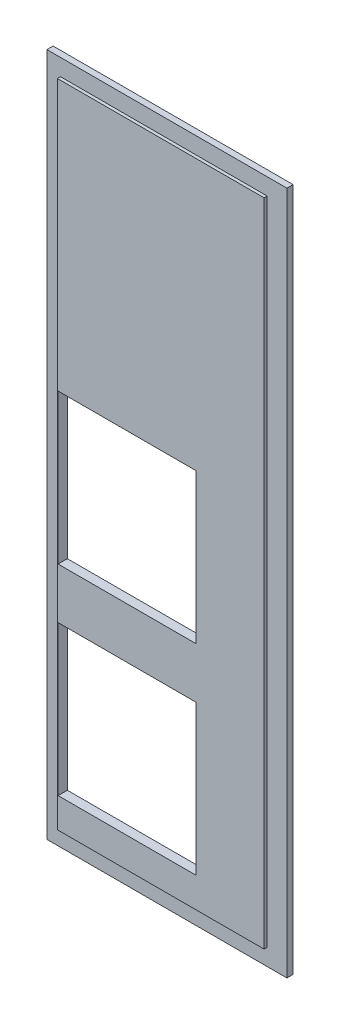
ISO-10303-21;
HEADER;
FILE_DESCRIPTION(('STEP AP214'),'2;1');
FILE_NAME('part.step','',(''),(''),'','','');
FILE_SCHEMA(('AUTOMOTIVE_DESIGN { 1 0 10303 214 1 1 1 1 }'));
ENDSEC;
DATA;
#1=APPLICATION_CONTEXT('core data for automotive mechanical design processes');
#2=APPLICATION_PROTOCOL_DEFINITION('international standard','automotive_design',2000,#1);
#3=PRODUCT_CONTEXT('',#1,'mechanical');
#4=PRODUCT('Part','Part','',(#3));
#5=PRODUCT_RELATED_PRODUCT_CATEGORY('part','',(#4));
#6=PRODUCT_DEFINITION_FORMATION('','',#4);
#7=PRODUCT_DEFINITION_CONTEXT('part definition',#1,'design');
#8=PRODUCT_DEFINITION('design','',#6,#7);
#9=PRODUCT_DEFINITION_SHAPE('','',#8);
#10=(LENGTH_UNIT() NAMED_UNIT(*) SI_UNIT(.MILLI.,.METRE.));
#11=(NAMED_UNIT(*) PLANE_ANGLE_UNIT() SI_UNIT($,.RADIAN.));
#12=(NAMED_UNIT(*) SI_UNIT($,.STERADIAN.) SOLID_ANGLE_UNIT());
#13=UNCERTAINTY_MEASURE_WITH_UNIT(LENGTH_MEASURE(1.E-05),#10,'distance_accuracy_value','');
#14=(GEOMETRIC_REPRESENTATION_CONTEXT(3) GLOBAL_UNCERTAINTY_ASSIGNED_CONTEXT((#13)) GLOBAL_UNIT_ASSIGNED_CONTEXT((#10,
#11,#12)) REPRESENTATION_CONTEXT('',''));
#15=CARTESIAN_POINT('',(0.,0.,0.));
#16=DIRECTION('',(0.,0.,1.));
#17=DIRECTION('',(1.,0.,0.));
#18=AXIS2_PLACEMENT_3D('',#15,#16,#17);
#19=CARTESIAN_POINT('',(3.90000000000003,-9.84999999999989,-1.));
#20=DIRECTION('',(0.,-1.,0.));
#21=DIRECTION('',(1.,0.,0.));
#22=AXIS2_PLACEMENT_3D('',#19,#20,#21);
#23=PLANE('',#22);
#24=DIRECTION('',(1.,0.,0.));
#25=VECTOR('',#24,1.);
#26=CARTESIAN_POINT('',(3.90000000000003,-9.84999999999989,0.));
#27=LINE('',#26,#25);
#28=CARTESIAN_POINT('',(3.90000000000003,-9.84999999999989,0.));
#29=VERTEX_POINT('',#28);
#30=CARTESIAN_POINT('',(42.75,-9.84999999999989,0.));
#31=VERTEX_POINT('',#30);
#32=EDGE_CURVE('E248',#29,#31,#27,.T.);
#33=ORIENTED_EDGE('',*,*,#32,.F.);
#34=DIRECTION('',(0.,0.,1.));
#35=VECTOR('',#34,1.);
#36=CARTESIAN_POINT('',(3.90000000000003,-9.84999999999989,-1.));
#37=LINE('',#36,#35);
#38=CARTESIAN_POINT('',(3.90000000000003,-9.84999999999989,-1.));
#39=VERTEX_POINT('',#38);
#40=EDGE_CURVE('E11',#39,#29,#37,.T.);
#41=ORIENTED_EDGE('',*,*,#40,.F.);
#42=DIRECTION('',(1.,0.,0.));
#43=VECTOR('',#42,1.);
#44=CARTESIAN_POINT('',(3.90000000000003,-9.84999999999989,-1.));
#45=LINE('',#44,#43);
#46=CARTESIAN_POINT('',(42.75,-9.84999999999989,-1.));
#47=VERTEX_POINT('',#46);
#48=EDGE_CURVE('E249',#39,#47,#45,.T.);
#49=ORIENTED_EDGE('',*,*,#48,.T.);
#50=DIRECTION('',(0.,0.,1.));
#51=VECTOR('',#50,1.);
#52=CARTESIAN_POINT('',(42.75,-9.84999999999989,-1.));
#53=LINE('',#52,#51);
#54=EDGE_CURVE('E35',#47,#31,#53,.T.);
#55=ORIENTED_EDGE('',*,*,#54,.T.);
#56=EDGE_LOOP('',(#33,#41,#49,#55));
#57=FACE_BOUND('',#56,.T.);
#58=ADVANCED_FACE('F32',(#57),#23,.T.);
#59=CARTESIAN_POINT('',(3.90000000000002,100.85,-1.));
#60=DIRECTION('',(-1.,0.,0.));
#61=DIRECTION('',(0.,-1.,0.));
#62=AXIS2_PLACEMENT_3D('',#59,#60,#61);
#63=PLANE('',#62);
#64=DIRECTION('',(0.,-1.,0.));
#65=VECTOR('',#64,1.);
#66=CARTESIAN_POINT('',(3.90000000000002,100.85,0.));
#67=LINE('',#66,#65);
#68=CARTESIAN_POINT('',(3.90000000000002,100.85,0.));
#69=VERTEX_POINT('',#68);
#70=EDGE_CURVE('E253',#69,#29,#67,.T.);
#71=ORIENTED_EDGE('',*,*,#70,.F.);
#72=DIRECTION('',(0.,0.,1.));
#73=VECTOR('',#72,1.);
#74=CARTESIAN_POINT('',(3.90000000000002,100.85,-1.));
#75=LINE('',#74,#73);
#76=CARTESIAN_POINT('',(3.90000000000002,100.85,-1.));
#77=VERTEX_POINT('',#76);
#78=EDGE_CURVE('E40',#77,#69,#75,.T.);
#79=ORIENTED_EDGE('',*,*,#78,.F.);
#80=DIRECTION('',(0.,-1.,0.));
#81=VECTOR('',#80,1.);
#82=CARTESIAN_POINT('',(3.90000000000002,100.85,-1.));
#83=LINE('',#82,#81);
#84=EDGE_CURVE('E259',#77,#39,#83,.T.);
#85=ORIENTED_EDGE('',*,*,#84,.T.);
#86=ORIENTED_EDGE('',*,*,#40,.T.);
#87=EDGE_LOOP('',(#71,#79,#85,#86));
#88=FACE_BOUND('',#87,.T.);
#89=ADVANCED_FACE('F285',(#88),#63,.T.);
#90=CARTESIAN_POINT('',(42.75,100.85,-1.));
#91=DIRECTION('',(0.,1.,0.));
#92=DIRECTION('',(0.,0.,1.));
#93=AXIS2_PLACEMENT_3D('',#90,#91,#92);
#94=PLANE('',#93);
#95=DIRECTION('',(-1.,0.,0.));
#96=VECTOR('',#95,1.);
#97=CARTESIAN_POINT('',(42.75,100.85,0.));
#98=LINE('',#97,#96);
#99=CARTESIAN_POINT('',(42.75,100.85,0.));
#100=VERTEX_POINT('',#99);
#101=EDGE_CURVE('E267',#100,#69,#98,.T.);
#102=ORIENTED_EDGE('',*,*,#101,.F.);
#103=DIRECTION('',(0.,0.,1.));
#104=VECTOR('',#103,1.);
#105=CARTESIAN_POINT('',(42.75,100.85,-1.));
#106=LINE('',#105,#104);
#107=CARTESIAN_POINT('',(42.75,100.85,-1.));
#108=VERTEX_POINT('',#107);
#109=EDGE_CURVE('E272',#108,#100,#106,.T.);
#110=ORIENTED_EDGE('',*,*,#109,.F.);
#111=DIRECTION('',(-1.,0.,0.));
#112=VECTOR('',#111,1.);
#113=CARTESIAN_POINT('',(42.75,100.85,-1.));
#114=LINE('',#113,#112);
#115=EDGE_CURVE('E256',#108,#77,#114,.T.);
#116=ORIENTED_EDGE('',*,*,#115,.T.);
#117=ORIENTED_EDGE('',*,*,#78,.T.);
#118=EDGE_LOOP('',(#102,#110,#116,#117));
#119=FACE_BOUND('',#118,.T.);
#120=ADVANCED_FACE('F291',(#119),#94,.T.);
#121=CARTESIAN_POINT('',(42.75,-9.84999999999989,-1.));
#122=DIRECTION('',(1.,0.,0.));
#123=DIRECTION('',(0.,1.,0.));
#124=AXIS2_PLACEMENT_3D('',#121,#122,#123);
#125=PLANE('',#124);
#126=DIRECTION('',(0.,1.,0.));
#127=VECTOR('',#126,1.);
#128=CARTESIAN_POINT('',(42.75,-9.84999999999989,0.));
#129=LINE('',#128,#127);
#130=EDGE_CURVE('E264',#31,#100,#129,.T.);
#131=ORIENTED_EDGE('',*,*,#130,.F.);
#132=ORIENTED_EDGE('',*,*,#54,.F.);
#133=DIRECTION('',(0.,1.,0.));
#134=VECTOR('',#133,1.);
#135=CARTESIAN_POINT('',(42.75,-9.84999999999989,-1.));
#136=LINE('',#135,#134);
#137=EDGE_CURVE('E252',#47,#108,#136,.T.);
#138=ORIENTED_EDGE('',*,*,#137,.T.);
#139=ORIENTED_EDGE('',*,*,#109,.T.);
#140=EDGE_LOOP('',(#131,#132,#138,#139));
#141=FACE_BOUND('',#140,.T.);
#142=ADVANCED_FACE('F280',(#141),#125,.T.);
#143=CARTESIAN_POINT('',(0.,0.,-1.));
#144=DIRECTION('',(0.,0.,1.));
#145=DIRECTION('',(1.,0.,0.));
#146=AXIS2_PLACEMENT_3D('',#143,#144,#145);
#147=PLANE('',#146);
#148=DIRECTION('',(-1.,0.,0.));
#149=VECTOR('',#148,1.);
#150=CARTESIAN_POINT('',(0.,54.4000000000001,-1.));
#151=LINE('',#150,#149);
#152=CARTESIAN_POINT('',(28.5555931067609,54.4000000000001,-1.));
#153=VERTEX_POINT('',#152);
#154=CARTESIAN_POINT('',(6.21619222488181,54.4000000000001,-1.));
#155=VERTEX_POINT('',#154);
#156=EDGE_CURVE('E209',#153,#155,#151,.T.);
#157=ORIENTED_EDGE('',*,*,#156,.T.);
#158=DIRECTION('',(0.,-1.,0.));
#159=VECTOR('',#158,1.);
#160=CARTESIAN_POINT('',(6.21619222488182,0.,-1.));
#161=LINE('',#160,#159);
#162=CARTESIAN_POINT('',(6.21619222488181,30.1500000000001,-1.));
#163=VERTEX_POINT('',#162);
#164=EDGE_CURVE('E212',#155,#163,#161,.T.);
#165=ORIENTED_EDGE('',*,*,#164,.T.);
#166=DIRECTION('',(1.,0.,0.));
#167=VECTOR('',#166,1.);
#168=CARTESIAN_POINT('',(0.,30.1500000000001,-1.));
#169=LINE('',#168,#167);
#170=CARTESIAN_POINT('',(28.5555931067609,30.1500000000001,-1.));
#171=VERTEX_POINT('',#170);
#172=EDGE_CURVE('E206',#163,#171,#169,.T.);
#173=ORIENTED_EDGE('',*,*,#172,.T.);
#174=DIRECTION('',(0.,1.,0.));
#175=VECTOR('',#174,1.);
#176=CARTESIAN_POINT('',(28.5555931067609,0.,-1.));
#177=LINE('',#176,#175);
#178=EDGE_CURVE('E150',#171,#153,#177,.T.);
#179=ORIENTED_EDGE('',*,*,#178,.T.);
#180=EDGE_LOOP('',(#157,#165,#173,#179));
#181=FACE_BOUND('',#180,.T.);
#182=DIRECTION('',(-1.,0.,0.));
#183=VECTOR('',#182,1.);
#184=CARTESIAN_POINT('',(0.,21.9444436948561,-1.));
#185=LINE('',#184,#183);
#186=CARTESIAN_POINT('',(28.5555931067609,21.9444436948561,-1.));
#187=VERTEX_POINT('',#186);
#188=CARTESIAN_POINT('',(6.21619222488181,21.9444436948561,-1.));
#189=VERTEX_POINT('',#188);
#190=EDGE_CURVE('E200',#187,#189,#185,.T.);
#191=ORIENTED_EDGE('',*,*,#190,.T.);
#192=DIRECTION('',(0.,-1.,0.));
#193=VECTOR('',#192,1.);
#194=CARTESIAN_POINT('',(6.21619222488182,0.,-1.));
#195=LINE('',#194,#193);
#196=CARTESIAN_POINT('',(6.21619222488182,-2.30555630514393,-1.));
#197=VERTEX_POINT('',#196);
#198=EDGE_CURVE('E203',#189,#197,#195,.T.);
#199=ORIENTED_EDGE('',*,*,#198,.T.);
#200=DIRECTION('',(1.,0.,0.));
#201=VECTOR('',#200,1.);
#202=CARTESIAN_POINT('',(0.,-2.30555630514393,-1.));
#203=LINE('',#202,#201);
#204=CARTESIAN_POINT('',(28.5555931067609,-2.30555630514393,-1.));
#205=VERTEX_POINT('',#204);
#206=EDGE_CURVE('E174',#197,#205,#203,.T.);
#207=ORIENTED_EDGE('',*,*,#206,.T.);
#208=DIRECTION('',(0.,1.,0.));
#209=VECTOR('',#208,1.);
#210=CARTESIAN_POINT('',(28.5555931067609,0.,-1.));
#211=LINE('',#210,#209);
#212=EDGE_CURVE('E197',#205,#187,#211,.T.);
#213=ORIENTED_EDGE('',*,*,#212,.T.);
#214=EDGE_LOOP('',(#191,#199,#207,#213));
#215=FACE_BOUND('',#214,.T.);
#216=ORIENTED_EDGE('',*,*,#48,.F.);
#217=ORIENTED_EDGE('',*,*,#84,.F.);
#218=ORIENTED_EDGE('',*,*,#115,.F.);
#219=ORIENTED_EDGE('',*,*,#137,.F.);
#220=EDGE_LOOP('',(#216,#217,#218,#219));
#221=FACE_BOUND('',#220,.T.);
#222=ADVANCED_FACE('F288',(#181,#215,#221),#147,.F.);
#223=CARTESIAN_POINT('',(0.,0.,0.));
#224=DIRECTION('',(0.,0.,1.));
#225=DIRECTION('',(1.,0.,0.));
#226=AXIS2_PLACEMENT_3D('',#223,#224,#225);
#227=PLANE('',#226);
#228=DIRECTION('',(0.,1.,0.));
#229=VECTOR('',#228,1.);
#230=CARTESIAN_POINT('',(39.55,98.1500000000001,0.));
#231=LINE('',#230,#229);
#232=CARTESIAN_POINT('',(39.55,-7.14999999999988,0.));
#233=VERTEX_POINT('',#232);
#234=CARTESIAN_POINT('',(39.55,98.1500000000001,0.));
#235=VERTEX_POINT('',#234);
#236=EDGE_CURVE('E215',#233,#235,#231,.T.);
#237=ORIENTED_EDGE('',*,*,#236,.F.);
#238=DIRECTION('',(1.,0.,0.));
#239=VECTOR('',#238,1.);
#240=CARTESIAN_POINT('',(39.55,-7.14999999999988,0.));
#241=LINE('',#240,#239);
#242=CARTESIAN_POINT('',(6.10000000000004,-7.14999999999988,0.));
#243=VERTEX_POINT('',#242);
#244=EDGE_CURVE('E220',#243,#233,#241,.T.);
#245=ORIENTED_EDGE('',*,*,#244,.F.);
#246=DIRECTION('',(0.,-1.,0.));
#247=VECTOR('',#246,1.);
#248=CARTESIAN_POINT('',(6.10000000000004,-7.14999999999988,0.));
#249=LINE('',#248,#247);
#250=CARTESIAN_POINT('',(6.10000000000002,98.1500000000001,0.));
#251=VERTEX_POINT('',#250);
#252=EDGE_CURVE('E232',#251,#243,#249,.T.);
#253=ORIENTED_EDGE('',*,*,#252,.F.);
#254=DIRECTION('',(-1.,0.,0.));
#255=VECTOR('',#254,1.);
#256=CARTESIAN_POINT('',(6.10000000000002,98.1500000000001,0.));
#257=LINE('',#256,#255);
#258=EDGE_CURVE('E229',#235,#251,#257,.T.);
#259=ORIENTED_EDGE('',*,*,#258,.F.);
#260=EDGE_LOOP('',(#237,#245,#253,#259));
#261=FACE_BOUND('',#260,.T.);
#262=ORIENTED_EDGE('',*,*,#32,.T.);
#263=ORIENTED_EDGE('',*,*,#130,.T.);
#264=ORIENTED_EDGE('',*,*,#101,.T.);
#265=ORIENTED_EDGE('',*,*,#70,.T.);
#266=EDGE_LOOP('',(#262,#263,#264,#265));
#267=FACE_BOUND('',#266,.T.);
#268=ADVANCED_FACE('F282',(#261,#267),#227,.T.);
#269=CARTESIAN_POINT('',(39.55,98.1500000000001,0.5));
#270=DIRECTION('',(-1.,0.,0.));
#271=DIRECTION('',(0.,-1.,0.));
#272=AXIS2_PLACEMENT_3D('',#269,#270,#271);
#273=PLANE('',#272);
#274=ORIENTED_EDGE('',*,*,#236,.T.);
#275=DIRECTION('',(0.,0.,-1.));
#276=VECTOR('',#275,1.);
#277=CARTESIAN_POINT('',(39.55,98.1500000000001,0.5));
#278=LINE('',#277,#276);
#279=CARTESIAN_POINT('',(39.55,98.1500000000001,0.5));
#280=VERTEX_POINT('',#279);
#281=EDGE_CURVE('E245',#280,#235,#278,.T.);
#282=ORIENTED_EDGE('',*,*,#281,.F.);
#283=DIRECTION('',(0.,1.,0.));
#284=VECTOR('',#283,1.);
#285=CARTESIAN_POINT('',(39.55,98.1500000000001,0.5));
#286=LINE('',#285,#284);
#287=CARTESIAN_POINT('',(39.55,-7.14999999999988,0.5));
#288=VERTEX_POINT('',#287);
#289=EDGE_CURVE('E216',#288,#280,#286,.T.);
#290=ORIENTED_EDGE('',*,*,#289,.F.);
#291=DIRECTION('',(0.,0.,-1.));
#292=VECTOR('',#291,1.);
#293=CARTESIAN_POINT('',(39.55,-7.14999999999988,0.5));
#294=LINE('',#293,#292);
#295=EDGE_CURVE('E226',#288,#233,#294,.T.);
#296=ORIENTED_EDGE('',*,*,#295,.T.);
#297=EDGE_LOOP('',(#274,#282,#290,#296));
#298=FACE_BOUND('',#297,.T.);
#299=ADVANCED_FACE('F327',(#298),#273,.F.);
#300=CARTESIAN_POINT('',(6.10000000000002,98.1500000000001,0.5));
#301=DIRECTION('',(0.,-1.,0.));
#302=DIRECTION('',(0.,0.,-1.));
#303=AXIS2_PLACEMENT_3D('',#300,#301,#302);
#304=PLANE('',#303);
#305=ORIENTED_EDGE('',*,*,#258,.T.);
#306=DIRECTION('',(0.,0.,-1.));
#307=VECTOR('',#306,1.);
#308=CARTESIAN_POINT('',(6.10000000000002,98.1500000000001,0.5));
#309=LINE('',#308,#307);
#310=CARTESIAN_POINT('',(6.10000000000002,98.1500000000001,0.5));
#311=VERTEX_POINT('',#310);
#312=EDGE_CURVE('E242',#311,#251,#309,.T.);
#313=ORIENTED_EDGE('',*,*,#312,.F.);
#314=DIRECTION('',(-1.,0.,0.));
#315=VECTOR('',#314,1.);
#316=CARTESIAN_POINT('',(6.10000000000002,98.1500000000001,0.5));
#317=LINE('',#316,#315);
#318=EDGE_CURVE('E219',#280,#311,#317,.T.);
#319=ORIENTED_EDGE('',*,*,#318,.F.);
#320=ORIENTED_EDGE('',*,*,#281,.T.);
#321=EDGE_LOOP('',(#305,#313,#319,#320));
#322=FACE_BOUND('',#321,.T.);
#323=ADVANCED_FACE('F337',(#322),#304,.F.);
#324=CARTESIAN_POINT('',(6.10000000000004,-7.14999999999988,0.5));
#325=DIRECTION('',(1.,0.,0.));
#326=DIRECTION('',(0.,1.,0.));
#327=AXIS2_PLACEMENT_3D('',#324,#325,#326);
#328=PLANE('',#327);
#329=ORIENTED_EDGE('',*,*,#252,.T.);
#330=DIRECTION('',(0.,0.,-1.));
#331=VECTOR('',#330,1.);
#332=CARTESIAN_POINT('',(6.10000000000004,-7.14999999999988,0.5));
#333=LINE('',#332,#331);
#334=CARTESIAN_POINT('',(6.10000000000004,-7.14999999999988,0.5));
#335=VERTEX_POINT('',#334);
#336=EDGE_CURVE('E239',#335,#243,#333,.T.);
#337=ORIENTED_EDGE('',*,*,#336,.F.);
#338=DIRECTION('',(0.,-1.,0.));
#339=VECTOR('',#338,1.);
#340=CARTESIAN_POINT('',(6.10000000000004,-7.14999999999988,0.5));
#341=LINE('',#340,#339);
#342=EDGE_CURVE('E222',#311,#335,#341,.T.);
#343=ORIENTED_EDGE('',*,*,#342,.F.);
#344=ORIENTED_EDGE('',*,*,#312,.T.);
#345=EDGE_LOOP('',(#329,#337,#343,#344));
#346=FACE_BOUND('',#345,.T.);
#347=ADVANCED_FACE('F347',(#346),#328,.F.);
#348=CARTESIAN_POINT('',(39.55,-7.14999999999988,0.5));
#349=DIRECTION('',(0.,1.,0.));
#350=DIRECTION('',(-1.,0.,0.));
#351=AXIS2_PLACEMENT_3D('',#348,#349,#350);
#352=PLANE('',#351);
#353=ORIENTED_EDGE('',*,*,#244,.T.);
#354=ORIENTED_EDGE('',*,*,#295,.F.);
#355=DIRECTION('',(1.,0.,0.));
#356=VECTOR('',#355,1.);
#357=CARTESIAN_POINT('',(39.55,-7.14999999999988,0.5));
#358=LINE('',#357,#356);
#359=EDGE_CURVE('E224',#335,#288,#358,.T.);
#360=ORIENTED_EDGE('',*,*,#359,.F.);
#361=ORIENTED_EDGE('',*,*,#336,.T.);
#362=EDGE_LOOP('',(#353,#354,#360,#361));
#363=FACE_BOUND('',#362,.T.);
#364=ADVANCED_FACE('F357',(#363),#352,.F.);
#365=CARTESIAN_POINT('',(0.,0.,0.5));
#366=DIRECTION('',(0.,0.,-1.));
#367=DIRECTION('',(-1.,0.,0.));
#368=AXIS2_PLACEMENT_3D('',#365,#366,#367);
#369=PLANE('',#368);
#370=DIRECTION('',(1.,0.,0.));
#371=VECTOR('',#370,1.);
#372=CARTESIAN_POINT('',(6.21619222488181,30.1500000000001,0.5));
#373=LINE('',#372,#371);
#374=CARTESIAN_POINT('',(6.21619222488181,30.1500000000001,0.5));
#375=VERTEX_POINT('',#374);
#376=CARTESIAN_POINT('',(28.5555931067609,30.1500000000001,0.5));
#377=VERTEX_POINT('',#376);
#378=EDGE_CURVE('E157',#375,#377,#373,.T.);
#379=ORIENTED_EDGE('',*,*,#378,.F.);
#380=DIRECTION('',(0.,-1.,0.));
#381=VECTOR('',#380,1.);
#382=CARTESIAN_POINT('',(6.21619222488181,54.4000000000001,0.5));
#383=LINE('',#382,#381);
#384=CARTESIAN_POINT('',(6.21619222488181,54.4000000000001,0.5));
#385=VERTEX_POINT('',#384);
#386=EDGE_CURVE('E162',#385,#375,#383,.T.);
#387=ORIENTED_EDGE('',*,*,#386,.F.);
#388=DIRECTION('',(-1.,0.,0.));
#389=VECTOR('',#388,1.);
#390=CARTESIAN_POINT('',(6.21619222488181,54.4000000000001,0.5));
#391=LINE('',#390,#389);
#392=CARTESIAN_POINT('',(28.5555931067609,54.4000000000001,0.5));
#393=VERTEX_POINT('',#392);
#394=EDGE_CURVE('E167',#393,#385,#391,.T.);
#395=ORIENTED_EDGE('',*,*,#394,.F.);
#396=DIRECTION('',(0.,1.,0.));
#397=VECTOR('',#396,1.);
#398=CARTESIAN_POINT('',(28.5555931067609,54.4000000000001,0.5));
#399=LINE('',#398,#397);
#400=EDGE_CURVE('E147',#377,#393,#399,.T.);
#401=ORIENTED_EDGE('',*,*,#400,.F.);
#402=EDGE_LOOP('',(#379,#387,#395,#401));
#403=FACE_BOUND('',#402,.T.);
#404=DIRECTION('',(1.,0.,0.));
#405=VECTOR('',#404,1.);
#406=CARTESIAN_POINT('',(6.21619222488182,-2.30555630514393,0.5));
#407=LINE('',#406,#405);
#408=CARTESIAN_POINT('',(6.21619222488182,-2.30555630514393,0.5));
#409=VERTEX_POINT('',#408);
#410=CARTESIAN_POINT('',(28.5555931067609,-2.30555630514393,0.5));
#411=VERTEX_POINT('',#410);
#412=EDGE_CURVE('E179',#409,#411,#407,.T.);
#413=ORIENTED_EDGE('',*,*,#412,.F.);
#414=DIRECTION('',(0.,-1.,0.));
#415=VECTOR('',#414,1.);
#416=CARTESIAN_POINT('',(6.21619222488181,21.9444436948561,0.5));
#417=LINE('',#416,#415);
#418=CARTESIAN_POINT('',(6.21619222488181,21.9444436948561,0.5));
#419=VERTEX_POINT('',#418);
#420=EDGE_CURVE('E177',#419,#409,#417,.T.);
#421=ORIENTED_EDGE('',*,*,#420,.F.);
#422=DIRECTION('',(-1.,0.,0.));
#423=VECTOR('',#422,1.);
#424=CARTESIAN_POINT('',(6.21619222488181,21.9444436948561,0.5));
#425=LINE('',#424,#423);
#426=CARTESIAN_POINT('',(28.5555931067609,21.9444436948561,0.5));
#427=VERTEX_POINT('',#426);
#428=EDGE_CURVE('E184',#427,#419,#425,.T.);
#429=ORIENTED_EDGE('',*,*,#428,.F.);
#430=DIRECTION('',(0.,1.,0.));
#431=VECTOR('',#430,1.);
#432=CARTESIAN_POINT('',(28.5555931067609,21.9444436948561,0.5));
#433=LINE('',#432,#431);
#434=EDGE_CURVE('E181',#411,#427,#433,.T.);
#435=ORIENTED_EDGE('',*,*,#434,.F.);
#436=EDGE_LOOP('',(#413,#421,#429,#435));
#437=FACE_BOUND('',#436,.T.);
#438=ORIENTED_EDGE('',*,*,#289,.T.);
#439=ORIENTED_EDGE('',*,*,#318,.T.);
#440=ORIENTED_EDGE('',*,*,#342,.T.);
#441=ORIENTED_EDGE('',*,*,#359,.T.);
#442=EDGE_LOOP('',(#438,#439,#440,#441));
#443=FACE_BOUND('',#442,.T.);
#444=ADVANCED_FACE('F164',(#403,#437,#443),#369,.F.);
#445=CARTESIAN_POINT('',(6.21619222488181,21.9444436948561,-1.5));
#446=DIRECTION('',(-1.,0.,0.));
#447=DIRECTION('',(0.,-1.,0.));
#448=AXIS2_PLACEMENT_3D('',#445,#446,#447);
#449=PLANE('',#448);
#450=DIRECTION('',(0.,0.,1.));
#451=VECTOR('',#450,1.);
#452=CARTESIAN_POINT('',(6.21619222488181,21.9444436948561,-1.5));
#453=LINE('',#452,#451);
#454=EDGE_CURVE('E188',#189,#419,#453,.T.);
#455=ORIENTED_EDGE('',*,*,#454,.T.);
#456=ORIENTED_EDGE('',*,*,#420,.T.);
#457=DIRECTION('',(0.,0.,1.));
#458=VECTOR('',#457,1.);
#459=CARTESIAN_POINT('',(6.21619222488182,-2.30555630514393,-1.5));
#460=LINE('',#459,#458);
#461=EDGE_CURVE('E187',#197,#409,#460,.T.);
#462=ORIENTED_EDGE('',*,*,#461,.F.);
#463=ORIENTED_EDGE('',*,*,#198,.F.);
#464=EDGE_LOOP('',(#455,#456,#462,#463));
#465=FACE_BOUND('',#464,.T.);
#466=ADVANCED_FACE('F383',(#465),#449,.F.);
#467=CARTESIAN_POINT('',(6.21619222488181,21.9444436948561,-1.5));
#468=DIRECTION('',(0.,1.,0.));
#469=DIRECTION('',(0.,0.,1.));
#470=AXIS2_PLACEMENT_3D('',#467,#468,#469);
#471=PLANE('',#470);
#472=DIRECTION('',(0.,0.,1.));
#473=VECTOR('',#472,1.);
#474=CARTESIAN_POINT('',(28.5555931067609,21.9444436948561,-1.5));
#475=LINE('',#474,#473);
#476=EDGE_CURVE('E190',#187,#427,#475,.T.);
#477=ORIENTED_EDGE('',*,*,#476,.T.);
#478=ORIENTED_EDGE('',*,*,#428,.T.);
#479=ORIENTED_EDGE('',*,*,#454,.F.);
#480=ORIENTED_EDGE('',*,*,#190,.F.);
#481=EDGE_LOOP('',(#477,#478,#479,#480));
#482=FACE_BOUND('',#481,.T.);
#483=ADVANCED_FACE('F392',(#482),#471,.F.);
#484=CARTESIAN_POINT('',(28.5555931067609,21.9444436948561,-1.5));
#485=DIRECTION('',(1.,0.,0.));
#486=DIRECTION('',(0.,1.,0.));
#487=AXIS2_PLACEMENT_3D('',#484,#485,#486);
#488=PLANE('',#487);
#489=DIRECTION('',(0.,0.,1.));
#490=VECTOR('',#489,1.);
#491=CARTESIAN_POINT('',(28.5555931067609,-2.30555630514393,-1.5));
#492=LINE('',#491,#490);
#493=EDGE_CURVE('E56',#205,#411,#492,.T.);
#494=ORIENTED_EDGE('',*,*,#493,.T.);
#495=ORIENTED_EDGE('',*,*,#434,.T.);
#496=ORIENTED_EDGE('',*,*,#476,.F.);
#497=ORIENTED_EDGE('',*,*,#212,.F.);
#498=EDGE_LOOP('',(#494,#495,#496,#497));
#499=FACE_BOUND('',#498,.T.);
#500=ADVANCED_FACE('F402',(#499),#488,.F.);
#501=CARTESIAN_POINT('',(6.21619222488182,-2.30555630514393,-1.5));
#502=DIRECTION('',(0.,-1.,0.));
#503=DIRECTION('',(0.,0.,-1.));
#504=AXIS2_PLACEMENT_3D('',#501,#502,#503);
#505=PLANE('',#504);
#506=ORIENTED_EDGE('',*,*,#461,.T.);
#507=ORIENTED_EDGE('',*,*,#412,.T.);
#508=ORIENTED_EDGE('',*,*,#493,.F.);
#509=ORIENTED_EDGE('',*,*,#206,.F.);
#510=EDGE_LOOP('',(#506,#507,#508,#509));
#511=FACE_BOUND('',#510,.T.);
#512=ADVANCED_FACE('F412',(#511),#505,.F.);
#513=CARTESIAN_POINT('',(6.21619222488181,54.4000000000001,-1.5));
#514=DIRECTION('',(-1.,0.,0.));
#515=DIRECTION('',(0.,-1.,0.));
#516=AXIS2_PLACEMENT_3D('',#513,#514,#515);
#517=PLANE('',#516);
#518=DIRECTION('',(0.,0.,1.));
#519=VECTOR('',#518,1.);
#520=CARTESIAN_POINT('',(6.21619222488181,54.4000000000001,-1.5));
#521=LINE('',#520,#519);
#522=EDGE_CURVE('E172',#155,#385,#521,.T.);
#523=ORIENTED_EDGE('',*,*,#522,.T.);
#524=ORIENTED_EDGE('',*,*,#386,.T.);
#525=DIRECTION('',(0.,0.,1.));
#526=VECTOR('',#525,1.);
#527=CARTESIAN_POINT('',(6.21619222488181,30.1500000000001,-1.5));
#528=LINE('',#527,#526);
#529=EDGE_CURVE('E153',#163,#375,#528,.T.);
#530=ORIENTED_EDGE('',*,*,#529,.F.);
#531=ORIENTED_EDGE('',*,*,#164,.F.);
#532=EDGE_LOOP('',(#523,#524,#530,#531));
#533=FACE_BOUND('',#532,.T.);
#534=ADVANCED_FACE('F422',(#533),#517,.F.);
#535=CARTESIAN_POINT('',(6.21619222488181,54.4000000000001,-1.5));
#536=DIRECTION('',(0.,1.,0.));
#537=DIRECTION('',(0.,0.,1.));
#538=AXIS2_PLACEMENT_3D('',#535,#536,#537);
#539=PLANE('',#538);
#540=DIRECTION('',(0.,0.,1.));
#541=VECTOR('',#540,1.);
#542=CARTESIAN_POINT('',(28.5555931067609,54.4000000000001,-1.5));
#543=LINE('',#542,#541);
#544=EDGE_CURVE('E152',#153,#393,#543,.T.);
#545=ORIENTED_EDGE('',*,*,#544,.T.);
#546=ORIENTED_EDGE('',*,*,#394,.T.);
#547=ORIENTED_EDGE('',*,*,#522,.F.);
#548=ORIENTED_EDGE('',*,*,#156,.F.);
#549=EDGE_LOOP('',(#545,#546,#547,#548));
#550=FACE_BOUND('',#549,.T.);
#551=ADVANCED_FACE('F431',(#550),#539,.F.);
#552=CARTESIAN_POINT('',(28.5555931067609,54.4000000000001,-1.5));
#553=DIRECTION('',(1.,0.,0.));
#554=DIRECTION('',(0.,0.,-1.));
#555=AXIS2_PLACEMENT_3D('',#552,#553,#554);
#556=PLANE('',#555);
#557=DIRECTION('',(0.,0.,1.));
#558=VECTOR('',#557,1.);
#559=CARTESIAN_POINT('',(28.5555931067609,30.1500000000001,-1.5));
#560=LINE('',#559,#558);
#561=EDGE_CURVE('E48',#171,#377,#560,.T.);
#562=ORIENTED_EDGE('',*,*,#561,.T.);
#563=ORIENTED_EDGE('',*,*,#400,.T.);
#564=ORIENTED_EDGE('',*,*,#544,.F.);
#565=ORIENTED_EDGE('',*,*,#178,.F.);
#566=EDGE_LOOP('',(#562,#563,#564,#565));
#567=FACE_BOUND('',#566,.T.);
#568=ADVANCED_FACE('F144',(#567),#556,.F.);
#569=CARTESIAN_POINT('',(6.21619222488181,30.1500000000001,-1.5));
#570=DIRECTION('',(0.,-1.,0.));
#571=DIRECTION('',(0.,0.,-1.));
#572=AXIS2_PLACEMENT_3D('',#569,#570,#571);
#573=PLANE('',#572);
#574=ORIENTED_EDGE('',*,*,#529,.T.);
#575=ORIENTED_EDGE('',*,*,#378,.T.);
#576=ORIENTED_EDGE('',*,*,#561,.F.);
#577=ORIENTED_EDGE('',*,*,#172,.F.);
#578=EDGE_LOOP('',(#574,#575,#576,#577));
#579=FACE_BOUND('',#578,.T.);
#580=ADVANCED_FACE('F158',(#579),#573,.F.);
#581=CLOSED_SHELL('',(#58,#89,#120,#142,#222,#268,#299,#323,#347,#364,#444,#466,#483,#500,#512,
#534,#551,#568,#580));
#582=MANIFOLD_SOLID_BREP('B2',#581);
#583=ADVANCED_BREP_SHAPE_REPRESENTATION('',(#18,#582),#14);
#584=SHAPE_DEFINITION_REPRESENTATION(#9,#583);
ENDSEC;
END-ISO-10303-21;
